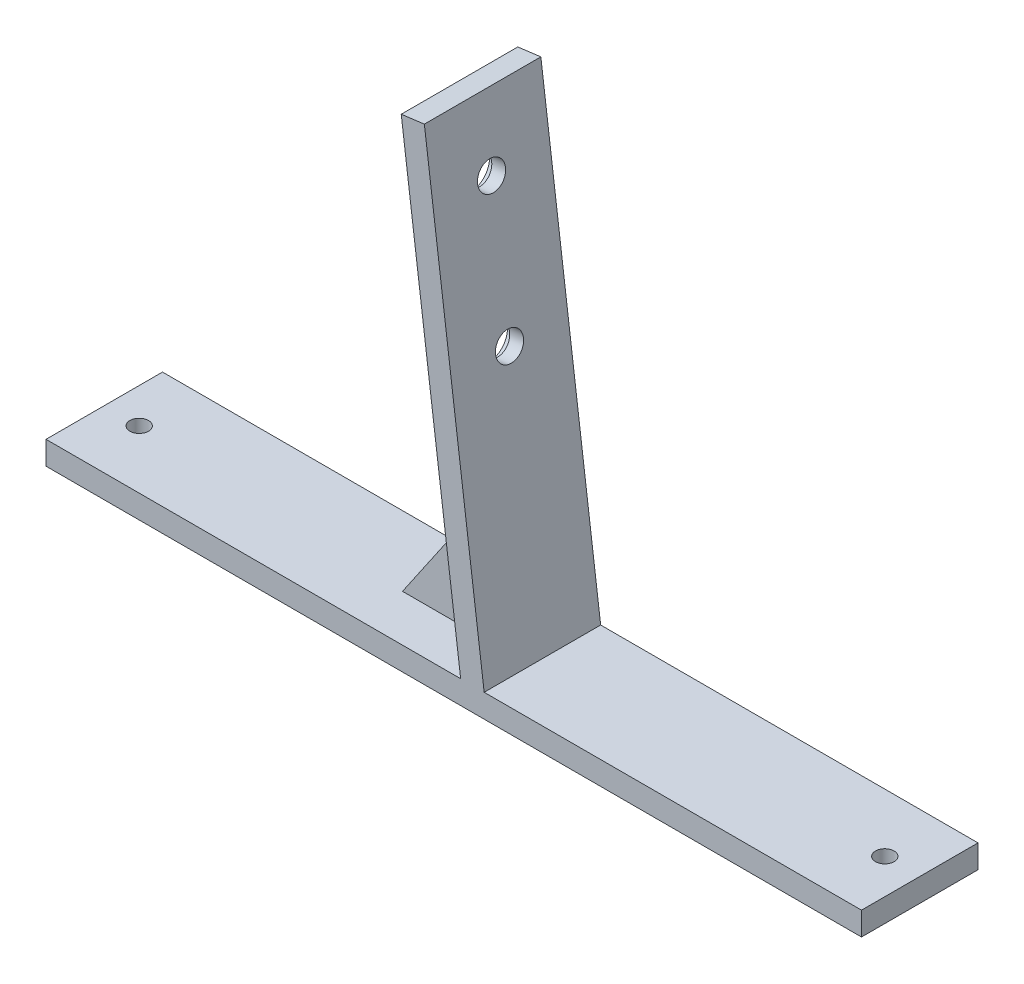
ISO-10303-21;
HEADER;
FILE_DESCRIPTION(('STEP AP214'),'2;1');
FILE_NAME('part.step','',(''),(''),'','','');
FILE_SCHEMA(('AUTOMOTIVE_DESIGN { 1 0 10303 214 1 1 1 1 }'));
ENDSEC;
DATA;
#1=APPLICATION_CONTEXT('core data for automotive mechanical design processes');
#2=APPLICATION_PROTOCOL_DEFINITION('international standard','automotive_design',2000,#1);
#3=PRODUCT_CONTEXT('',#1,'mechanical');
#4=PRODUCT('Part','Part','',(#3));
#5=PRODUCT_RELATED_PRODUCT_CATEGORY('part','',(#4));
#6=PRODUCT_DEFINITION_FORMATION('','',#4);
#7=PRODUCT_DEFINITION_CONTEXT('part definition',#1,'design');
#8=PRODUCT_DEFINITION('design','',#6,#7);
#9=PRODUCT_DEFINITION_SHAPE('','',#8);
#10=(LENGTH_UNIT() NAMED_UNIT(*) SI_UNIT(.MILLI.,.METRE.));
#11=(NAMED_UNIT(*) PLANE_ANGLE_UNIT() SI_UNIT($,.RADIAN.));
#12=(NAMED_UNIT(*) SI_UNIT($,.STERADIAN.) SOLID_ANGLE_UNIT());
#13=UNCERTAINTY_MEASURE_WITH_UNIT(LENGTH_MEASURE(1.E-05),#10,'distance_accuracy_value','');
#14=(GEOMETRIC_REPRESENTATION_CONTEXT(3) GLOBAL_UNCERTAINTY_ASSIGNED_CONTEXT((#13)) GLOBAL_UNIT_ASSIGNED_CONTEXT((#10,
#11,#12)) REPRESENTATION_CONTEXT('',''));
#15=CARTESIAN_POINT('',(0.,0.,0.));
#16=DIRECTION('',(0.,0.,1.));
#17=DIRECTION('',(1.,0.,0.));
#18=AXIS2_PLACEMENT_3D('',#15,#16,#17);
#19=CARTESIAN_POINT('',(146.396695875651,176.027452877868,-25.));
#20=DIRECTION('',(0.991730579444842,0.128337281387746,0.));
#21=DIRECTION('',(-0.128337281387746,0.991730579444842,0.));
#22=AXIS2_PLACEMENT_3D('',#19,#20,#21);
#23=CYLINDRICAL_SURFACE('',#22,6.);
#24=CARTESIAN_POINT('',(166.231307464548,178.594198505623,-25.));
#25=DIRECTION('',(0.991730579444842,0.128337281387746,0.));
#26=DIRECTION('',(-0.128337281387746,0.991730579444842,0.));
#27=AXIS2_PLACEMENT_3D('',#24,#25,#26);
#28=CIRCLE('',#27,6.);
#29=CARTESIAN_POINT('',(165.461283776222,184.544581982292,-25.));
#30=VERTEX_POINT('',#29);
#31=EDGE_CURVE('E291',#30,#30,#28,.T.);
#32=ORIENTED_EDGE('',*,*,#31,.T.);
#33=EDGE_LOOP('',(#32));
#34=FACE_BOUND('',#33,.T.);
#35=CARTESIAN_POINT('',(160.280923987879,177.824174817297,-25.));
#36=DIRECTION('',(-0.991730579444842,-0.128337281387747,0.));
#37=DIRECTION('',(0.128337281387747,-0.991730579444842,0.));
#38=AXIS2_PLACEMENT_3D('',#35,#36,#37);
#39=CIRCLE('',#38,6.);
#40=CARTESIAN_POINT('',(161.050947676206,171.873791340628,-25.));
#41=VERTEX_POINT('',#40);
#42=EDGE_CURVE('E73',#41,#41,#39,.F.);
#43=ORIENTED_EDGE('',*,*,#42,.F.);
#44=EDGE_LOOP('',(#43));
#45=FACE_BOUND('',#44,.T.);
#46=ADVANCED_FACE('F69',(#34,#45),#23,.F.);
#47=CARTESIAN_POINT('',(154.096932758916,116.523618111178,-25.));
#48=DIRECTION('',(0.991730579444842,0.128337281387746,0.));
#49=DIRECTION('',(-0.128337281387746,0.991730579444842,0.));
#50=AXIS2_PLACEMENT_3D('',#47,#48,#49);
#51=CYLINDRICAL_SURFACE('',#50,6.);
#52=CARTESIAN_POINT('',(173.931544347813,119.090363738933,-25.));
#53=DIRECTION('',(0.991730579444842,0.128337281387746,0.));
#54=DIRECTION('',(-0.128337281387746,0.991730579444842,0.));
#55=AXIS2_PLACEMENT_3D('',#52,#53,#54);
#56=CIRCLE('',#55,6.);
#57=CARTESIAN_POINT('',(173.161520659486,125.040747215602,-25.));
#58=VERTEX_POINT('',#57);
#59=EDGE_CURVE('E310',#58,#58,#56,.T.);
#60=ORIENTED_EDGE('',*,*,#59,.T.);
#61=EDGE_LOOP('',(#60));
#62=FACE_BOUND('',#61,.T.);
#63=CARTESIAN_POINT('',(167.981160871144,118.320340050606,-25.));
#64=DIRECTION('',(-0.991730579444842,-0.128337281387747,0.));
#65=DIRECTION('',(0.128337281387747,-0.991730579444842,0.));
#66=AXIS2_PLACEMENT_3D('',#63,#64,#65);
#67=CIRCLE('',#66,6.);
#68=CARTESIAN_POINT('',(168.75118455947,112.369956573937,-25.));
#69=VERTEX_POINT('',#68);
#70=EDGE_CURVE('E281',#69,#69,#67,.F.);
#71=ORIENTED_EDGE('',*,*,#70,.F.);
#72=EDGE_LOOP('',(#71));
#73=FACE_BOUND('',#72,.T.);
#74=ADVANCED_FACE('F345',(#62,#73),#51,.F.);
#75=CARTESIAN_POINT('',(85.8865417872083,-58.8076170808221,-50.));
#76=DIRECTION('',(0.825114060002271,-0.564966183046887,0.));
#77=DIRECTION('',(0.564966183046887,0.825114060002271,0.));
#78=AXIS2_PLACEMENT_3D('',#75,#76,#77);
#79=PLANE('',#78);
#80=DIRECTION('',(0.564966183046887,0.825114060002271,0.));
#81=VECTOR('',#80,1.);
#82=CARTESIAN_POINT('',(170.817867859885,65.2317208124105,-30.));
#83=LINE('',#82,#81);
#84=CARTESIAN_POINT('',(133.,10.,-30.));
#85=VERTEX_POINT('',#84);
#86=CARTESIAN_POINT('',(170.817867859885,65.2317208124105,-30.));
#87=VERTEX_POINT('',#86);
#88=EDGE_CURVE('E87',#85,#87,#83,.T.);
#89=ORIENTED_EDGE('',*,*,#88,.F.);
#90=DIRECTION('',(0.,0.,1.));
#91=VECTOR('',#90,1.);
#92=CARTESIAN_POINT('',(133.,10.,-50.));
#93=LINE('',#92,#91);
#94=CARTESIAN_POINT('',(133.,10.,-20.));
#95=VERTEX_POINT('',#94);
#96=EDGE_CURVE('E176',#85,#95,#93,.T.);
#97=ORIENTED_EDGE('',*,*,#96,.T.);
#98=DIRECTION('',(-0.564966183046887,-0.825114060002271,0.));
#99=VECTOR('',#98,1.);
#100=CARTESIAN_POINT('',(85.8865417872083,-58.8076170808221,-20.));
#101=LINE('',#100,#99);
#102=CARTESIAN_POINT('',(170.817867859885,65.2317208124105,-20.));
#103=VERTEX_POINT('',#102);
#104=EDGE_CURVE('E187',#103,#95,#101,.T.);
#105=ORIENTED_EDGE('',*,*,#104,.F.);
#106=DIRECTION('',(0.,0.,1.));
#107=VECTOR('',#106,1.);
#108=CARTESIAN_POINT('',(170.817867859885,65.2317208124105,-50.));
#109=LINE('',#108,#107);
#110=EDGE_CURVE('E218',#87,#103,#109,.T.);
#111=ORIENTED_EDGE('',*,*,#110,.F.);
#112=EDGE_LOOP('',(#89,#97,#105,#111));
#113=FACE_BOUND('',#112,.T.);
#114=ADVANCED_FACE('F350',(#113),#79,.F.);
#115=CARTESIAN_POINT('',(0.,10.,0.));
#116=DIRECTION('',(0.,0.,-1.));
#117=DIRECTION('',(-1.,0.,0.));
#118=AXIS2_PLACEMENT_3D('',#115,#116,#117);
#119=PLANE('',#118);
#120=DIRECTION('',(-0.128337281387747,0.991730579444842,0.));
#121=VECTOR('',#120,1.);
#122=CARTESIAN_POINT('',(176.306852294727,22.8154123534262,0.));
#123=LINE('',#122,#121);
#124=CARTESIAN_POINT('',(177.965261559694,10.,0.));
#125=VERTEX_POINT('',#124);
#126=CARTESIAN_POINT('',(152.463883228467,207.062743075091,0.));
#127=VERTEX_POINT('',#126);
#128=EDGE_CURVE('E199',#125,#127,#123,.T.);
#129=ORIENTED_EDGE('',*,*,#128,.F.);
#130=DIRECTION('',(1.,0.,0.));
#131=VECTOR('',#130,1.);
#132=CARTESIAN_POINT('',(0.,10.,0.));
#133=LINE('',#132,#131);
#134=CARTESIAN_POINT('',(0.,10.,0.));
#135=VERTEX_POINT('',#134);
#136=EDGE_CURVE('E249',#135,#125,#133,.T.);
#137=ORIENTED_EDGE('',*,*,#136,.F.);
#138=DIRECTION('',(0.,-1.,0.));
#139=VECTOR('',#138,1.);
#140=CARTESIAN_POINT('',(0.,10.,0.));
#141=LINE('',#140,#139);
#142=CARTESIAN_POINT('',(0.,0.,0.));
#143=VERTEX_POINT('',#142);
#144=EDGE_CURVE('E12',#135,#143,#141,.T.);
#145=ORIENTED_EDGE('',*,*,#144,.T.);
#146=DIRECTION('',(1.,0.,0.));
#147=VECTOR('',#146,1.);
#148=CARTESIAN_POINT('',(0.,0.,0.));
#149=LINE('',#148,#147);
#150=CARTESIAN_POINT('',(350.,0.,0.));
#151=VERTEX_POINT('',#150);
#152=EDGE_CURVE('E264',#143,#151,#149,.T.);
#153=ORIENTED_EDGE('',*,*,#152,.T.);
#154=DIRECTION('',(0.,-1.,0.));
#155=VECTOR('',#154,1.);
#156=CARTESIAN_POINT('',(350.,10.,0.));
#157=LINE('',#156,#155);
#158=CARTESIAN_POINT('',(350.,10.,0.));
#159=VERTEX_POINT('',#158);
#160=EDGE_CURVE('E79',#159,#151,#157,.T.);
#161=ORIENTED_EDGE('',*,*,#160,.F.);
#162=CARTESIAN_POINT('',(188.048645300465,10.,0.));
#163=VERTEX_POINT('',#162);
#164=EDGE_CURVE('E247',#163,#159,#133,.T.);
#165=ORIENTED_EDGE('',*,*,#164,.F.);
#166=DIRECTION('',(0.128337281387746,-0.991730579444842,0.));
#167=VECTOR('',#166,1.);
#168=CARTESIAN_POINT('',(186.224158089176,24.0987851673035,0.));
#169=LINE('',#168,#167);
#170=CARTESIAN_POINT('',(162.381189022916,208.346115888969,0.));
#171=VERTEX_POINT('',#170);
#172=EDGE_CURVE('E95',#171,#163,#169,.T.);
#173=ORIENTED_EDGE('',*,*,#172,.F.);
#174=DIRECTION('',(0.991730579444842,0.128337281387747,0.));
#175=VECTOR('',#174,1.);
#176=CARTESIAN_POINT('',(-23.8429690662601,184.247330721665,0.));
#177=LINE('',#176,#175);
#178=EDGE_CURVE('E207',#127,#171,#177,.T.);
#179=ORIENTED_EDGE('',*,*,#178,.F.);
#180=EDGE_LOOP('',(#129,#137,#145,#153,#161,#165,#173,#179));
#181=FACE_BOUND('',#180,.T.);
#182=ADVANCED_FACE('F362',(#181),#119,.F.);
#183=CARTESIAN_POINT('',(0.,10.,0.));
#184=DIRECTION('',(0.,-1.,0.));
#185=DIRECTION('',(0.,0.,-1.));
#186=AXIS2_PLACEMENT_3D('',#183,#184,#185);
#187=PLANE('',#186);
#188=CARTESIAN_POINT('',(15.,10.,-25.));
#189=DIRECTION('',(0.,1.,0.));
#190=DIRECTION('',(0.,0.,1.));
#191=AXIS2_PLACEMENT_3D('',#188,#189,#190);
#192=CIRCLE('',#191,4.);
#193=CARTESIAN_POINT('',(15.,10.,-21.));
#194=VERTEX_POINT('',#193);
#195=EDGE_CURVE('E235',#194,#194,#192,.T.);
#196=ORIENTED_EDGE('',*,*,#195,.F.);
#197=EDGE_LOOP('',(#196));
#198=FACE_BOUND('',#197,.T.);
#199=ORIENTED_EDGE('',*,*,#96,.F.);
#200=DIRECTION('',(-1.,0.,0.));
#201=VECTOR('',#200,1.);
#202=CARTESIAN_POINT('',(177.965261559694,10.,-30.));
#203=LINE('',#202,#201);
#204=CARTESIAN_POINT('',(177.965261559694,10.,-30.));
#205=VERTEX_POINT('',#204);
#206=EDGE_CURVE('E168',#205,#85,#203,.T.);
#207=ORIENTED_EDGE('',*,*,#206,.F.);
#208=DIRECTION('',(0.,0.,-1.));
#209=VECTOR('',#208,1.);
#210=CARTESIAN_POINT('',(177.965261559694,10.,-30.));
#211=LINE('',#210,#209);
#212=CARTESIAN_POINT('',(177.965261559694,10.,-50.));
#213=VERTEX_POINT('',#212);
#214=EDGE_CURVE('E158',#205,#213,#211,.T.);
#215=ORIENTED_EDGE('',*,*,#214,.T.);
#216=DIRECTION('',(-1.,0.,0.));
#217=VECTOR('',#216,1.);
#218=CARTESIAN_POINT('',(0.,10.,-50.));
#219=LINE('',#218,#217);
#220=CARTESIAN_POINT('',(0.,10.,-50.));
#221=VERTEX_POINT('',#220);
#222=EDGE_CURVE('E255',#213,#221,#219,.T.);
#223=ORIENTED_EDGE('',*,*,#222,.T.);
#224=DIRECTION('',(0.,0.,1.));
#225=VECTOR('',#224,1.);
#226=CARTESIAN_POINT('',(0.,10.,0.));
#227=LINE('',#226,#225);
#228=EDGE_CURVE('E243',#221,#135,#227,.T.);
#229=ORIENTED_EDGE('',*,*,#228,.T.);
#230=ORIENTED_EDGE('',*,*,#136,.T.);
#231=DIRECTION('',(0.,0.,1.));
#232=VECTOR('',#231,1.);
#233=CARTESIAN_POINT('',(177.965261559694,10.,-20.));
#234=LINE('',#233,#232);
#235=CARTESIAN_POINT('',(177.965261559694,10.,-20.));
#236=VERTEX_POINT('',#235);
#237=EDGE_CURVE('E191',#236,#125,#234,.T.);
#238=ORIENTED_EDGE('',*,*,#237,.F.);
#239=DIRECTION('',(-1.,0.,0.));
#240=VECTOR('',#239,1.);
#241=CARTESIAN_POINT('',(0.,10.,-20.));
#242=LINE('',#241,#240);
#243=EDGE_CURVE('E167',#236,#95,#242,.T.);
#244=ORIENTED_EDGE('',*,*,#243,.T.);
#245=EDGE_LOOP('',(#199,#207,#215,#223,#229,#230,#238,#244));
#246=FACE_BOUND('',#245,.T.);
#247=ADVANCED_FACE('F174',(#198,#246),#187,.F.);
#248=CARTESIAN_POINT('',(350.,10.,-50.));
#249=VERTEX_POINT('',#248);
#250=CARTESIAN_POINT('',(188.048645300465,10.,-50.));
#251=VERTEX_POINT('',#250);
#252=EDGE_CURVE('E256',#249,#251,#219,.T.);
#253=ORIENTED_EDGE('',*,*,#252,.T.);
#254=DIRECTION('',(0.,0.,1.));
#255=VECTOR('',#254,1.);
#256=CARTESIAN_POINT('',(188.048645300465,10.,-50.));
#257=LINE('',#256,#255);
#258=EDGE_CURVE('E212',#251,#163,#257,.T.);
#259=ORIENTED_EDGE('',*,*,#258,.T.);
#260=ORIENTED_EDGE('',*,*,#164,.T.);
#261=DIRECTION('',(0.,0.,-1.));
#262=VECTOR('',#261,1.);
#263=CARTESIAN_POINT('',(350.,10.,0.));
#264=LINE('',#263,#262);
#265=EDGE_CURVE('E252',#159,#249,#264,.T.);
#266=ORIENTED_EDGE('',*,*,#265,.T.);
#267=EDGE_LOOP('',(#253,#259,#260,#266));
#268=FACE_BOUND('',#267,.T.);
#269=CARTESIAN_POINT('',(335.,10.,-25.));
#270=DIRECTION('',(0.,1.,0.));
#271=DIRECTION('',(0.,0.,-1.));
#272=AXIS2_PLACEMENT_3D('',#269,#270,#271);
#273=CIRCLE('',#272,3.99999999999999);
#274=CARTESIAN_POINT('',(335.,10.,-29.));
#275=VERTEX_POINT('',#274);
#276=EDGE_CURVE('E227',#275,#275,#273,.T.);
#277=ORIENTED_EDGE('',*,*,#276,.F.);
#278=EDGE_LOOP('',(#277));
#279=FACE_BOUND('',#278,.T.);
#280=ADVANCED_FACE('F429',(#268,#279),#187,.F.);
#281=CARTESIAN_POINT('',(0.,0.,0.));
#282=DIRECTION('',(0.,-1.,0.));
#283=DIRECTION('',(0.,0.,-1.));
#284=AXIS2_PLACEMENT_3D('',#281,#282,#283);
#285=PLANE('',#284);
#286=CARTESIAN_POINT('',(15.,0.,-25.));
#287=DIRECTION('',(0.,1.,0.));
#288=DIRECTION('',(0.,0.,1.));
#289=AXIS2_PLACEMENT_3D('',#286,#287,#288);
#290=CIRCLE('',#289,4.);
#291=CARTESIAN_POINT('',(15.,0.,-21.));
#292=VERTEX_POINT('',#291);
#293=EDGE_CURVE('E231',#292,#292,#290,.T.);
#294=ORIENTED_EDGE('',*,*,#293,.T.);
#295=EDGE_LOOP('',(#294));
#296=FACE_BOUND('',#295,.T.);
#297=DIRECTION('',(0.,0.,1.));
#298=VECTOR('',#297,1.);
#299=CARTESIAN_POINT('',(0.,0.,0.));
#300=LINE('',#299,#298);
#301=CARTESIAN_POINT('',(0.,0.,-50.));
#302=VERTEX_POINT('',#301);
#303=EDGE_CURVE('E239',#302,#143,#300,.T.);
#304=ORIENTED_EDGE('',*,*,#303,.F.);
#305=DIRECTION('',(-1.,0.,0.));
#306=VECTOR('',#305,1.);
#307=CARTESIAN_POINT('',(0.,0.,-50.));
#308=LINE('',#307,#306);
#309=CARTESIAN_POINT('',(350.,0.,-50.));
#310=VERTEX_POINT('',#309);
#311=EDGE_CURVE('E248',#310,#302,#308,.T.);
#312=ORIENTED_EDGE('',*,*,#311,.F.);
#313=DIRECTION('',(0.,0.,-1.));
#314=VECTOR('',#313,1.);
#315=CARTESIAN_POINT('',(350.,0.,0.));
#316=LINE('',#315,#314);
#317=EDGE_CURVE('E267',#151,#310,#316,.T.);
#318=ORIENTED_EDGE('',*,*,#317,.F.);
#319=ORIENTED_EDGE('',*,*,#152,.F.);
#320=EDGE_LOOP('',(#304,#312,#318,#319));
#321=FACE_BOUND('',#320,.T.);
#322=CARTESIAN_POINT('',(335.,0.,-25.));
#323=DIRECTION('',(0.,1.,0.));
#324=DIRECTION('',(0.,0.,-1.));
#325=AXIS2_PLACEMENT_3D('',#322,#323,#324);
#326=CIRCLE('',#325,3.99999999999999);
#327=CARTESIAN_POINT('',(335.,0.,-29.));
#328=VERTEX_POINT('',#327);
#329=EDGE_CURVE('E215',#328,#328,#326,.T.);
#330=ORIENTED_EDGE('',*,*,#329,.T.);
#331=EDGE_LOOP('',(#330));
#332=FACE_BOUND('',#331,.T.);
#333=ADVANCED_FACE('F436',(#296,#321,#332),#285,.T.);
#334=CARTESIAN_POINT('',(0.,10.,0.));
#335=DIRECTION('',(1.,0.,0.));
#336=DIRECTION('',(0.,0.,-1.));
#337=AXIS2_PLACEMENT_3D('',#334,#335,#336);
#338=PLANE('',#337);
#339=ORIENTED_EDGE('',*,*,#303,.T.);
#340=ORIENTED_EDGE('',*,*,#144,.F.);
#341=ORIENTED_EDGE('',*,*,#228,.F.);
#342=DIRECTION('',(0.,-1.,0.));
#343=VECTOR('',#342,1.);
#344=CARTESIAN_POINT('',(0.,10.,-50.));
#345=LINE('',#344,#343);
#346=EDGE_CURVE('E260',#221,#302,#345,.T.);
#347=ORIENTED_EDGE('',*,*,#346,.T.);
#348=EDGE_LOOP('',(#339,#340,#341,#347));
#349=FACE_BOUND('',#348,.T.);
#350=ADVANCED_FACE('F71',(#349),#338,.F.);
#351=CARTESIAN_POINT('',(350.,10.,0.));
#352=DIRECTION('',(-1.,0.,0.));
#353=DIRECTION('',(0.,0.,1.));
#354=AXIS2_PLACEMENT_3D('',#351,#352,#353);
#355=PLANE('',#354);
#356=ORIENTED_EDGE('',*,*,#317,.T.);
#357=DIRECTION('',(0.,-1.,0.));
#358=VECTOR('',#357,1.);
#359=CARTESIAN_POINT('',(350.,10.,-50.));
#360=LINE('',#359,#358);
#361=EDGE_CURVE('E275',#249,#310,#360,.T.);
#362=ORIENTED_EDGE('',*,*,#361,.F.);
#363=ORIENTED_EDGE('',*,*,#265,.F.);
#364=ORIENTED_EDGE('',*,*,#160,.T.);
#365=EDGE_LOOP('',(#356,#362,#363,#364));
#366=FACE_BOUND('',#365,.T.);
#367=ADVANCED_FACE('F433',(#366),#355,.F.);
#368=CARTESIAN_POINT('',(0.,10.,-50.));
#369=DIRECTION('',(0.,0.,1.));
#370=DIRECTION('',(1.,0.,0.));
#371=AXIS2_PLACEMENT_3D('',#368,#369,#370);
#372=PLANE('',#371);
#373=ORIENTED_EDGE('',*,*,#222,.F.);
#374=DIRECTION('',(-0.128337281387747,0.991730579444842,0.));
#375=VECTOR('',#374,1.);
#376=CARTESIAN_POINT('',(176.306852294727,22.8154123534262,-50.));
#377=LINE('',#376,#375);
#378=CARTESIAN_POINT('',(152.463883228467,207.062743075091,-50.));
#379=VERTEX_POINT('',#378);
#380=EDGE_CURVE('E163',#213,#379,#377,.T.);
#381=ORIENTED_EDGE('',*,*,#380,.T.);
#382=DIRECTION('',(0.991730579444842,0.128337281387747,0.));
#383=VECTOR('',#382,1.);
#384=CARTESIAN_POINT('',(-23.8429690662601,184.247330721665,-50.));
#385=LINE('',#384,#383);
#386=CARTESIAN_POINT('',(162.381189022916,208.346115888969,-50.));
#387=VERTEX_POINT('',#386);
#388=EDGE_CURVE('E198',#379,#387,#385,.T.);
#389=ORIENTED_EDGE('',*,*,#388,.T.);
#390=DIRECTION('',(0.128337281387746,-0.991730579444842,0.));
#391=VECTOR('',#390,1.);
#392=CARTESIAN_POINT('',(186.224158089176,24.0987851673035,-50.));
#393=LINE('',#392,#391);
#394=EDGE_CURVE('E195',#387,#251,#393,.T.);
#395=ORIENTED_EDGE('',*,*,#394,.T.);
#396=ORIENTED_EDGE('',*,*,#252,.F.);
#397=ORIENTED_EDGE('',*,*,#361,.T.);
#398=ORIENTED_EDGE('',*,*,#311,.T.);
#399=ORIENTED_EDGE('',*,*,#346,.F.);
#400=EDGE_LOOP('',(#373,#381,#389,#395,#396,#397,#398,#399));
#401=FACE_BOUND('',#400,.T.);
#402=ADVANCED_FACE('F420',(#401),#372,.F.);
#403=CARTESIAN_POINT('',(15.,10.,-25.));
#404=DIRECTION('',(0.,-1.,0.));
#405=DIRECTION('',(0.,0.,-1.));
#406=AXIS2_PLACEMENT_3D('',#403,#404,#405);
#407=CYLINDRICAL_SURFACE('',#406,4.);
#408=ORIENTED_EDGE('',*,*,#195,.T.);
#409=EDGE_LOOP('',(#408));
#410=FACE_BOUND('',#409,.T.);
#411=ORIENTED_EDGE('',*,*,#293,.F.);
#412=EDGE_LOOP('',(#411));
#413=FACE_BOUND('',#412,.T.);
#414=ADVANCED_FACE('F340',(#410,#413),#407,.F.);
#415=CARTESIAN_POINT('',(335.,10.,-25.));
#416=DIRECTION('',(0.,-1.,0.));
#417=DIRECTION('',(0.,0.,-1.));
#418=AXIS2_PLACEMENT_3D('',#415,#416,#417);
#419=CYLINDRICAL_SURFACE('',#418,3.99999999999999);
#420=ORIENTED_EDGE('',*,*,#276,.T.);
#421=EDGE_LOOP('',(#420));
#422=FACE_BOUND('',#421,.T.);
#423=ORIENTED_EDGE('',*,*,#329,.F.);
#424=EDGE_LOOP('',(#423));
#425=FACE_BOUND('',#424,.T.);
#426=ADVANCED_FACE('F328',(#422,#425),#419,.F.);
#427=CARTESIAN_POINT('',(186.224158089176,24.0987851673035,-50.));
#428=DIRECTION('',(-0.991730579444842,-0.128337281387746,0.));
#429=DIRECTION('',(0.128337281387746,-0.991730579444842,0.));
#430=AXIS2_PLACEMENT_3D('',#427,#428,#429);
#431=PLANE('',#430);
#432=ORIENTED_EDGE('',*,*,#59,.F.);
#433=EDGE_LOOP('',(#432));
#434=FACE_BOUND('',#433,.T.);
#435=ORIENTED_EDGE('',*,*,#31,.F.);
#436=EDGE_LOOP('',(#435));
#437=FACE_BOUND('',#436,.T.);
#438=ORIENTED_EDGE('',*,*,#172,.T.);
#439=ORIENTED_EDGE('',*,*,#258,.F.);
#440=ORIENTED_EDGE('',*,*,#394,.F.);
#441=DIRECTION('',(0.,0.,1.));
#442=VECTOR('',#441,1.);
#443=CARTESIAN_POINT('',(162.381189022916,208.346115888969,-50.));
#444=LINE('',#443,#442);
#445=EDGE_CURVE('E204',#387,#171,#444,.T.);
#446=ORIENTED_EDGE('',*,*,#445,.T.);
#447=EDGE_LOOP('',(#438,#439,#440,#446));
#448=FACE_BOUND('',#447,.T.);
#449=ADVANCED_FACE('F326',(#434,#437,#448),#431,.F.);
#450=CARTESIAN_POINT('',(176.306852294727,22.8154123534262,-50.));
#451=DIRECTION('',(0.991730579444842,0.128337281387747,0.));
#452=DIRECTION('',(-0.128337281387747,0.991730579444842,0.));
#453=AXIS2_PLACEMENT_3D('',#450,#451,#452);
#454=PLANE('',#453);
#455=CARTESIAN_POINT('',(156.3140016701,177.310825691746,-25.));
#456=DIRECTION('',(-0.991730579444842,-0.128337281387747,0.));
#457=DIRECTION('',(0.128337281387747,-0.991730579444842,0.));
#458=AXIS2_PLACEMENT_3D('',#455,#456,#457);
#459=CIRCLE('',#458,9.00000000000001);
#460=CARTESIAN_POINT('',(157.469037202589,168.385250476742,-25.));
#461=VERTEX_POINT('',#460);
#462=EDGE_CURVE('E293',#461,#461,#459,.T.);
#463=ORIENTED_EDGE('',*,*,#462,.F.);
#464=EDGE_LOOP('',(#463));
#465=FACE_BOUND('',#464,.T.);
#466=CARTESIAN_POINT('',(164.014238553365,117.806990925055,-25.));
#467=DIRECTION('',(-0.991730579444842,-0.128337281387747,0.));
#468=DIRECTION('',(0.128337281387747,-0.991730579444842,0.));
#469=AXIS2_PLACEMENT_3D('',#466,#467,#468);
#470=CIRCLE('',#469,9.);
#471=CARTESIAN_POINT('',(165.169274085854,108.881415710052,-25.));
#472=VERTEX_POINT('',#471);
#473=EDGE_CURVE('E300',#472,#472,#470,.T.);
#474=ORIENTED_EDGE('',*,*,#473,.F.);
#475=EDGE_LOOP('',(#474));
#476=FACE_BOUND('',#475,.T.);
#477=ORIENTED_EDGE('',*,*,#128,.T.);
#478=DIRECTION('',(0.,0.,1.));
#479=VECTOR('',#478,1.);
#480=CARTESIAN_POINT('',(152.463883228467,207.062743075091,-50.));
#481=LINE('',#480,#479);
#482=EDGE_CURVE('E221',#379,#127,#481,.T.);
#483=ORIENTED_EDGE('',*,*,#482,.F.);
#484=ORIENTED_EDGE('',*,*,#380,.F.);
#485=ORIENTED_EDGE('',*,*,#214,.F.);
#486=DIRECTION('',(0.128337281387747,-0.991730579444842,0.));
#487=VECTOR('',#486,1.);
#488=CARTESIAN_POINT('',(170.817867859885,65.2317208124105,-30.));
#489=LINE('',#488,#487);
#490=EDGE_CURVE('E160',#87,#205,#489,.T.);
#491=ORIENTED_EDGE('',*,*,#490,.F.);
#492=ORIENTED_EDGE('',*,*,#110,.T.);
#493=DIRECTION('',(0.128337281387747,-0.991730579444842,0.));
#494=VECTOR('',#493,1.);
#495=CARTESIAN_POINT('',(176.306852294727,22.8154123534262,-20.));
#496=LINE('',#495,#494);
#497=EDGE_CURVE('E184',#103,#236,#496,.T.);
#498=ORIENTED_EDGE('',*,*,#497,.T.);
#499=ORIENTED_EDGE('',*,*,#237,.T.);
#500=EDGE_LOOP('',(#477,#483,#484,#485,#491,#492,#498,#499));
#501=FACE_BOUND('',#500,.T.);
#502=ADVANCED_FACE('F159',(#465,#476,#501),#454,.F.);
#503=CARTESIAN_POINT('',(-23.8429690662601,184.247330721665,-50.));
#504=DIRECTION('',(0.128337281387747,-0.991730579444842,0.));
#505=DIRECTION('',(0.991730579444842,0.128337281387747,0.));
#506=AXIS2_PLACEMENT_3D('',#503,#504,#505);
#507=PLANE('',#506);
#508=ORIENTED_EDGE('',*,*,#178,.T.);
#509=ORIENTED_EDGE('',*,*,#445,.F.);
#510=ORIENTED_EDGE('',*,*,#388,.F.);
#511=ORIENTED_EDGE('',*,*,#482,.T.);
#512=EDGE_LOOP('',(#508,#509,#510,#511));
#513=FACE_BOUND('',#512,.T.);
#514=ADVANCED_FACE('F336',(#513),#507,.F.);
#515=CARTESIAN_POINT('',(0.,0.,-20.));
#516=DIRECTION('',(0.,0.,1.));
#517=DIRECTION('',(1.,0.,0.));
#518=AXIS2_PLACEMENT_3D('',#515,#516,#517);
#519=PLANE('',#518);
#520=ORIENTED_EDGE('',*,*,#243,.F.);
#521=ORIENTED_EDGE('',*,*,#497,.F.);
#522=ORIENTED_EDGE('',*,*,#104,.T.);
#523=EDGE_LOOP('',(#520,#521,#522));
#524=FACE_BOUND('',#523,.T.);
#525=ADVANCED_FACE('F357',(#524),#519,.T.);
#526=CARTESIAN_POINT('',(0.,0.,-30.));
#527=DIRECTION('',(0.,0.,-1.));
#528=DIRECTION('',(-1.,0.,0.));
#529=AXIS2_PLACEMENT_3D('',#526,#527,#528);
#530=PLANE('',#529);
#531=ORIENTED_EDGE('',*,*,#88,.T.);
#532=ORIENTED_EDGE('',*,*,#490,.T.);
#533=ORIENTED_EDGE('',*,*,#206,.T.);
#534=EDGE_LOOP('',(#531,#532,#533));
#535=FACE_BOUND('',#534,.T.);
#536=ADVANCED_FACE('F170',(#535),#530,.T.);
#537=CARTESIAN_POINT('',(167.981160871144,118.320340050606,-25.));
#538=DIRECTION('',(-0.991730579444842,-0.128337281387747,0.));
#539=DIRECTION('',(0.128337281387747,-0.991730579444842,0.));
#540=AXIS2_PLACEMENT_3D('',#537,#538,#539);
#541=PLANE('',#540);
#542=CARTESIAN_POINT('',(167.981160871144,118.320340050606,-25.));
#543=DIRECTION('',(-0.991730579444842,-0.128337281387747,0.));
#544=DIRECTION('',(0.128337281387747,-0.991730579444842,0.));
#545=AXIS2_PLACEMENT_3D('',#542,#543,#544);
#546=CIRCLE('',#545,9.);
#547=CARTESIAN_POINT('',(169.136196403634,109.394764835603,-25.));
#548=VERTEX_POINT('',#547);
#549=EDGE_CURVE('E306',#548,#548,#546,.T.);
#550=ORIENTED_EDGE('',*,*,#549,.T.);
#551=EDGE_LOOP('',(#550));
#552=FACE_BOUND('',#551,.T.);
#553=ORIENTED_EDGE('',*,*,#70,.T.);
#554=EDGE_LOOP('',(#553));
#555=FACE_BOUND('',#554,.T.);
#556=ADVANCED_FACE('F356',(#552,#555),#541,.T.);
#557=CARTESIAN_POINT('',(167.981160871144,118.320340050606,-25.));
#558=DIRECTION('',(-0.991730579444842,-0.128337281387747,0.));
#559=DIRECTION('',(0.128337281387747,-0.991730579444842,0.));
#560=AXIS2_PLACEMENT_3D('',#557,#558,#559);
#561=CYLINDRICAL_SURFACE('',#560,9.);
#562=ORIENTED_EDGE('',*,*,#549,.F.);
#563=EDGE_LOOP('',(#562));
#564=FACE_BOUND('',#563,.T.);
#565=ORIENTED_EDGE('',*,*,#473,.T.);
#566=EDGE_LOOP('',(#565));
#567=FACE_BOUND('',#566,.T.);
#568=ADVANCED_FACE('F566',(#564,#567),#561,.F.);
#569=CARTESIAN_POINT('',(160.280923987879,177.824174817297,-25.));
#570=DIRECTION('',(-0.991730579444842,-0.128337281387747,0.));
#571=DIRECTION('',(0.128337281387747,-0.991730579444842,0.));
#572=AXIS2_PLACEMENT_3D('',#569,#570,#571);
#573=PLANE('',#572);
#574=CARTESIAN_POINT('',(160.280923987879,177.824174817297,-25.));
#575=DIRECTION('',(-0.991730579444842,-0.128337281387747,0.));
#576=DIRECTION('',(0.128337281387747,-0.991730579444842,0.));
#577=AXIS2_PLACEMENT_3D('',#574,#575,#576);
#578=CIRCLE('',#577,9.00000000000001);
#579=CARTESIAN_POINT('',(161.435959520369,168.898599602293,-25.));
#580=VERTEX_POINT('',#579);
#581=EDGE_CURVE('E284',#580,#580,#578,.T.);
#582=ORIENTED_EDGE('',*,*,#581,.T.);
#583=EDGE_LOOP('',(#582));
#584=FACE_BOUND('',#583,.T.);
#585=ORIENTED_EDGE('',*,*,#42,.T.);
#586=EDGE_LOOP('',(#585));
#587=FACE_BOUND('',#586,.T.);
#588=ADVANCED_FACE('F574',(#584,#587),#573,.T.);
#589=CARTESIAN_POINT('',(160.280923987879,177.824174817297,-25.));
#590=DIRECTION('',(-0.991730579444842,-0.128337281387747,0.));
#591=DIRECTION('',(0.128337281387747,-0.991730579444842,0.));
#592=AXIS2_PLACEMENT_3D('',#589,#590,#591);
#593=CYLINDRICAL_SURFACE('',#592,9.00000000000001);
#594=ORIENTED_EDGE('',*,*,#581,.F.);
#595=EDGE_LOOP('',(#594));
#596=FACE_BOUND('',#595,.T.);
#597=ORIENTED_EDGE('',*,*,#462,.T.);
#598=EDGE_LOOP('',(#597));
#599=FACE_BOUND('',#598,.T.);
#600=ADVANCED_FACE('F583',(#596,#599),#593,.F.);
#601=CLOSED_SHELL('',(#46,#74,#114,#182,#247,#280,#333,#350,#367,#402,#414,#426,#449,#502,#514,
#525,#536,#556,#568,#588,#600));
#602=MANIFOLD_SOLID_BREP('B2',#601);
#603=ADVANCED_BREP_SHAPE_REPRESENTATION('',(#18,#602),#14);
#604=SHAPE_DEFINITION_REPRESENTATION(#9,#603);
ENDSEC;
END-ISO-10303-21;
